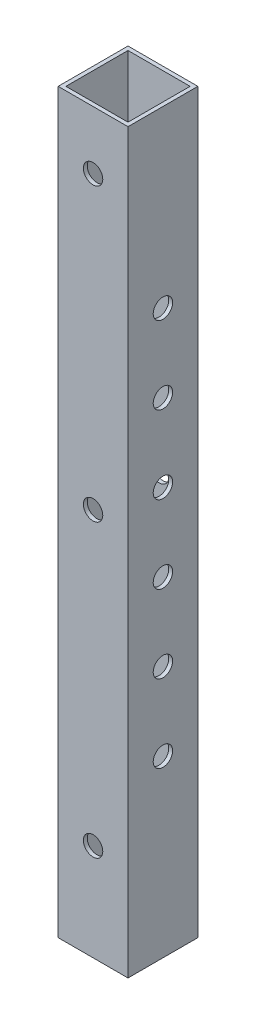
ISO-10303-21;
HEADER;
FILE_DESCRIPTION(('STEP AP214'),'2;1');
FILE_NAME('part.step','',(''),(''),'','','');
FILE_SCHEMA(('AUTOMOTIVE_DESIGN { 1 0 10303 214 1 1 1 1 }'));
ENDSEC;
DATA;
#1=APPLICATION_CONTEXT('core data for automotive mechanical design processes');
#2=APPLICATION_PROTOCOL_DEFINITION('international standard','automotive_design',2000,#1);
#3=PRODUCT_CONTEXT('',#1,'mechanical');
#4=PRODUCT('Part','Part','',(#3));
#5=PRODUCT_RELATED_PRODUCT_CATEGORY('part','',(#4));
#6=PRODUCT_DEFINITION_FORMATION('','',#4);
#7=PRODUCT_DEFINITION_CONTEXT('part definition',#1,'design');
#8=PRODUCT_DEFINITION('design','',#6,#7);
#9=PRODUCT_DEFINITION_SHAPE('','',#8);
#10=(LENGTH_UNIT() NAMED_UNIT(*) SI_UNIT(.MILLI.,.METRE.));
#11=(NAMED_UNIT(*) PLANE_ANGLE_UNIT() SI_UNIT($,.RADIAN.));
#12=(NAMED_UNIT(*) SI_UNIT($,.STERADIAN.) SOLID_ANGLE_UNIT());
#13=UNCERTAINTY_MEASURE_WITH_UNIT(LENGTH_MEASURE(1.E-05),#10,'distance_accuracy_value','');
#14=(GEOMETRIC_REPRESENTATION_CONTEXT(3) GLOBAL_UNCERTAINTY_ASSIGNED_CONTEXT((#13)) GLOBAL_UNIT_ASSIGNED_CONTEXT((#10,
#11,#12)) REPRESENTATION_CONTEXT('',''));
#15=CARTESIAN_POINT('',(0.,0.,0.));
#16=DIRECTION('',(0.,0.,1.));
#17=DIRECTION('',(1.,0.,0.));
#18=AXIS2_PLACEMENT_3D('',#15,#16,#17);
#19=CARTESIAN_POINT('',(0.,0.,45.72));
#20=DIRECTION('',(0.,-1.,0.));
#21=DIRECTION('',(0.,0.,-1.));
#22=AXIS2_PLACEMENT_3D('',#19,#20,#21);
#23=PLANE('',#22);
#24=DIRECTION('',(-1.,0.,0.));
#25=VECTOR('',#24,1.);
#26=CARTESIAN_POINT('',(0.,0.,0.));
#27=LINE('',#26,#25);
#28=CARTESIAN_POINT('',(45.72,0.,0.));
#29=VERTEX_POINT('',#28);
#30=CARTESIAN_POINT('',(0.,0.,0.));
#31=VERTEX_POINT('',#30);
#32=EDGE_CURVE('E142',#29,#31,#27,.T.);
#33=ORIENTED_EDGE('',*,*,#32,.T.);
#34=DIRECTION('',(0.,0.,-1.));
#35=VECTOR('',#34,1.);
#36=CARTESIAN_POINT('',(0.,0.,45.72));
#37=LINE('',#36,#35);
#38=CARTESIAN_POINT('',(0.,0.,45.72));
#39=VERTEX_POINT('',#38);
#40=EDGE_CURVE('E148',#39,#31,#37,.T.);
#41=ORIENTED_EDGE('',*,*,#40,.F.);
#42=DIRECTION('',(-1.,0.,0.));
#43=VECTOR('',#42,1.);
#44=CARTESIAN_POINT('',(0.,0.,45.72));
#45=LINE('',#44,#43);
#46=CARTESIAN_POINT('',(45.72,0.,45.72));
#47=VERTEX_POINT('',#46);
#48=EDGE_CURVE('E146',#47,#39,#45,.T.);
#49=ORIENTED_EDGE('',*,*,#48,.F.);
#50=DIRECTION('',(0.,0.,-1.));
#51=VECTOR('',#50,1.);
#52=CARTESIAN_POINT('',(45.72,0.,45.72));
#53=LINE('',#52,#51);
#54=EDGE_CURVE('E158',#47,#29,#53,.T.);
#55=ORIENTED_EDGE('',*,*,#54,.T.);
#56=EDGE_LOOP('',(#33,#41,#49,#55));
#57=FACE_BOUND('',#56,.T.);
#58=DIRECTION('',(-1.,0.,0.));
#59=VECTOR('',#58,1.);
#60=CARTESIAN_POINT('',(0.,0.,2.54));
#61=LINE('',#60,#59);
#62=CARTESIAN_POINT('',(43.18,0.,2.54));
#63=VERTEX_POINT('',#62);
#64=CARTESIAN_POINT('',(2.54,0.,2.54));
#65=VERTEX_POINT('',#64);
#66=EDGE_CURVE('E109',#63,#65,#61,.T.);
#67=ORIENTED_EDGE('',*,*,#66,.F.);
#68=DIRECTION('',(0.,0.,-1.));
#69=VECTOR('',#68,1.);
#70=CARTESIAN_POINT('',(43.18,0.,45.72));
#71=LINE('',#70,#69);
#72=CARTESIAN_POINT('',(43.18,0.,43.18));
#73=VERTEX_POINT('',#72);
#74=EDGE_CURVE('E132',#73,#63,#71,.T.);
#75=ORIENTED_EDGE('',*,*,#74,.F.);
#76=DIRECTION('',(-1.,0.,0.));
#77=VECTOR('',#76,1.);
#78=CARTESIAN_POINT('',(0.,0.,43.18));
#79=LINE('',#78,#77);
#80=CARTESIAN_POINT('',(2.54,0.,43.18));
#81=VERTEX_POINT('',#80);
#82=EDGE_CURVE('E57',#73,#81,#79,.T.);
#83=ORIENTED_EDGE('',*,*,#82,.T.);
#84=DIRECTION('',(0.,0.,-1.));
#85=VECTOR('',#84,1.);
#86=CARTESIAN_POINT('',(2.54,0.,45.72));
#87=LINE('',#86,#85);
#88=EDGE_CURVE('E108',#81,#65,#87,.T.);
#89=ORIENTED_EDGE('',*,*,#88,.T.);
#90=EDGE_LOOP('',(#67,#75,#83,#89));
#91=FACE_BOUND('',#90,.T.);
#92=ADVANCED_FACE('F35',(#57,#91),#23,.F.);
#93=CARTESIAN_POINT('',(0.,0.,45.72));
#94=DIRECTION('',(1.,0.,0.));
#95=DIRECTION('',(0.,1.,0.));
#96=AXIS2_PLACEMENT_3D('',#93,#94,#95);
#97=PLANE('',#96);
#98=CARTESIAN_POINT('',(0.,-114.3,22.86));
#99=DIRECTION('',(1.,0.,0.));
#100=DIRECTION('',(0.,0.,-1.));
#101=AXIS2_PLACEMENT_3D('',#98,#99,#100);
#102=CIRCLE('',#101,6.34999999999999);
#103=CARTESIAN_POINT('',(0.,-114.3,16.51));
#104=VERTEX_POINT('',#103);
#105=EDGE_CURVE('E547',#104,#104,#102,.T.);
#106=ORIENTED_EDGE('',*,*,#105,.T.);
#107=EDGE_LOOP('',(#106));
#108=FACE_BOUND('',#107,.T.);
#109=CARTESIAN_POINT('',(0.,-165.1,22.86));
#110=DIRECTION('',(1.,0.,0.));
#111=DIRECTION('',(0.,0.,-1.));
#112=AXIS2_PLACEMENT_3D('',#109,#110,#111);
#113=CIRCLE('',#112,6.34999999999999);
#114=CARTESIAN_POINT('',(0.,-165.1,16.51));
#115=VERTEX_POINT('',#114);
#116=EDGE_CURVE('E200',#115,#115,#113,.T.);
#117=ORIENTED_EDGE('',*,*,#116,.T.);
#118=EDGE_LOOP('',(#117));
#119=FACE_BOUND('',#118,.T.);
#120=CARTESIAN_POINT('',(0.,-215.9,22.86));
#121=DIRECTION('',(1.,0.,0.));
#122=DIRECTION('',(0.,0.,-1.));
#123=AXIS2_PLACEMENT_3D('',#120,#121,#122);
#124=CIRCLE('',#123,6.34999999999999);
#125=CARTESIAN_POINT('',(0.,-215.9,16.51));
#126=VERTEX_POINT('',#125);
#127=EDGE_CURVE('E196',#126,#126,#124,.T.);
#128=ORIENTED_EDGE('',*,*,#127,.T.);
#129=EDGE_LOOP('',(#128));
#130=FACE_BOUND('',#129,.T.);
#131=CARTESIAN_POINT('',(0.,-266.7,22.86));
#132=DIRECTION('',(1.,0.,0.));
#133=DIRECTION('',(0.,0.,-1.));
#134=AXIS2_PLACEMENT_3D('',#131,#132,#133);
#135=CIRCLE('',#134,6.34999999999997);
#136=CARTESIAN_POINT('',(0.,-266.7,16.51));
#137=VERTEX_POINT('',#136);
#138=EDGE_CURVE('E192',#137,#137,#135,.T.);
#139=ORIENTED_EDGE('',*,*,#138,.T.);
#140=EDGE_LOOP('',(#139));
#141=FACE_BOUND('',#140,.T.);
#142=CARTESIAN_POINT('',(0.,-317.5,22.86));
#143=DIRECTION('',(1.,0.,0.));
#144=DIRECTION('',(0.,0.,-1.));
#145=AXIS2_PLACEMENT_3D('',#142,#143,#144);
#146=CIRCLE('',#145,6.34999999999997);
#147=CARTESIAN_POINT('',(0.,-317.5,16.51));
#148=VERTEX_POINT('',#147);
#149=EDGE_CURVE('E187',#148,#148,#146,.T.);
#150=ORIENTED_EDGE('',*,*,#149,.T.);
#151=EDGE_LOOP('',(#150));
#152=FACE_BOUND('',#151,.T.);
#153=CARTESIAN_POINT('',(0.,-368.3,22.86));
#154=DIRECTION('',(1.,0.,0.));
#155=DIRECTION('',(0.,0.,-1.));
#156=AXIS2_PLACEMENT_3D('',#153,#154,#155);
#157=CIRCLE('',#156,6.34999999999997);
#158=CARTESIAN_POINT('',(0.,-368.3,16.51));
#159=VERTEX_POINT('',#158);
#160=EDGE_CURVE('E182',#159,#159,#157,.T.);
#161=ORIENTED_EDGE('',*,*,#160,.T.);
#162=EDGE_LOOP('',(#161));
#163=FACE_BOUND('',#162,.T.);
#164=DIRECTION('',(0.,-1.,0.));
#165=VECTOR('',#164,1.);
#166=CARTESIAN_POINT('',(0.,0.,0.));
#167=LINE('',#166,#165);
#168=CARTESIAN_POINT('',(0.,-482.6,0.));
#169=VERTEX_POINT('',#168);
#170=EDGE_CURVE('E136',#31,#169,#167,.T.);
#171=ORIENTED_EDGE('',*,*,#170,.T.);
#172=DIRECTION('',(0.,0.,-1.));
#173=VECTOR('',#172,1.);
#174=CARTESIAN_POINT('',(0.,-482.6,45.72));
#175=LINE('',#174,#173);
#176=CARTESIAN_POINT('',(0.,-482.6,45.72));
#177=VERTEX_POINT('',#176);
#178=EDGE_CURVE('E11',#177,#169,#175,.T.);
#179=ORIENTED_EDGE('',*,*,#178,.F.);
#180=DIRECTION('',(0.,-1.,0.));
#181=VECTOR('',#180,1.);
#182=CARTESIAN_POINT('',(0.,0.,45.72));
#183=LINE('',#182,#181);
#184=EDGE_CURVE('E138',#39,#177,#183,.T.);
#185=ORIENTED_EDGE('',*,*,#184,.F.);
#186=ORIENTED_EDGE('',*,*,#40,.T.);
#187=EDGE_LOOP('',(#171,#179,#185,#186));
#188=FACE_BOUND('',#187,.T.);
#189=ADVANCED_FACE('F37',(#108,#119,#130,#141,#152,#163,#188),#97,.F.);
#190=CARTESIAN_POINT('',(0.,-482.6,45.72));
#191=DIRECTION('',(0.,1.,0.));
#192=DIRECTION('',(0.,0.,1.));
#193=AXIS2_PLACEMENT_3D('',#190,#191,#192);
#194=PLANE('',#193);
#195=DIRECTION('',(-1.,0.,0.));
#196=VECTOR('',#195,1.);
#197=CARTESIAN_POINT('',(43.18,-482.6,43.18));
#198=LINE('',#197,#196);
#199=CARTESIAN_POINT('',(43.18,-482.6,43.18));
#200=VERTEX_POINT('',#199);
#201=CARTESIAN_POINT('',(2.54000000000006,-482.6,43.18));
#202=VERTEX_POINT('',#201);
#203=EDGE_CURVE('E112',#200,#202,#198,.T.);
#204=ORIENTED_EDGE('',*,*,#203,.F.);
#205=DIRECTION('',(0.,0.,1.));
#206=VECTOR('',#205,1.);
#207=CARTESIAN_POINT('',(43.18,-482.6,2.54));
#208=LINE('',#207,#206);
#209=CARTESIAN_POINT('',(43.18,-482.6,2.54));
#210=VERTEX_POINT('',#209);
#211=EDGE_CURVE('E116',#210,#200,#208,.T.);
#212=ORIENTED_EDGE('',*,*,#211,.F.);
#213=DIRECTION('',(1.,0.,0.));
#214=VECTOR('',#213,1.);
#215=CARTESIAN_POINT('',(2.54000000000006,-482.6,2.54));
#216=LINE('',#215,#214);
#217=CARTESIAN_POINT('',(2.54000000000006,-482.6,2.54));
#218=VERTEX_POINT('',#217);
#219=EDGE_CURVE('E121',#218,#210,#216,.T.);
#220=ORIENTED_EDGE('',*,*,#219,.F.);
#221=DIRECTION('',(0.,0.,-1.));
#222=VECTOR('',#221,1.);
#223=CARTESIAN_POINT('',(2.54000000000006,-482.6,43.18));
#224=LINE('',#223,#222);
#225=EDGE_CURVE('E105',#202,#218,#224,.T.);
#226=ORIENTED_EDGE('',*,*,#225,.F.);
#227=EDGE_LOOP('',(#204,#212,#220,#226));
#228=FACE_BOUND('',#227,.T.);
#229=DIRECTION('',(1.,0.,0.));
#230=VECTOR('',#229,1.);
#231=CARTESIAN_POINT('',(0.,-482.6,0.));
#232=LINE('',#231,#230);
#233=CARTESIAN_POINT('',(45.7200000000001,-482.6,0.));
#234=VERTEX_POINT('',#233);
#235=EDGE_CURVE('E151',#169,#234,#232,.T.);
#236=ORIENTED_EDGE('',*,*,#235,.T.);
#237=DIRECTION('',(0.,0.,-1.));
#238=VECTOR('',#237,1.);
#239=CARTESIAN_POINT('',(45.7200000000001,-482.6,45.72));
#240=LINE('',#239,#238);
#241=CARTESIAN_POINT('',(45.7200000000001,-482.6,45.72));
#242=VERTEX_POINT('',#241);
#243=EDGE_CURVE('E44',#242,#234,#240,.T.);
#244=ORIENTED_EDGE('',*,*,#243,.F.);
#245=DIRECTION('',(1.,0.,0.));
#246=VECTOR('',#245,1.);
#247=CARTESIAN_POINT('',(0.,-482.6,45.72));
#248=LINE('',#247,#246);
#249=EDGE_CURVE('E141',#177,#242,#248,.T.);
#250=ORIENTED_EDGE('',*,*,#249,.F.);
#251=ORIENTED_EDGE('',*,*,#178,.T.);
#252=EDGE_LOOP('',(#236,#244,#250,#251));
#253=FACE_BOUND('',#252,.T.);
#254=ADVANCED_FACE('F118',(#228,#253),#194,.F.);
#255=CARTESIAN_POINT('',(45.72,0.,45.72));
#256=DIRECTION('',(-1.,0.,0.));
#257=DIRECTION('',(0.,-1.,0.));
#258=AXIS2_PLACEMENT_3D('',#255,#256,#257);
#259=PLANE('',#258);
#260=CARTESIAN_POINT('',(45.7200000000001,-114.3,22.86));
#261=DIRECTION('',(1.,0.,0.));
#262=DIRECTION('',(0.,0.,-1.));
#263=AXIS2_PLACEMENT_3D('',#260,#261,#262);
#264=CIRCLE('',#263,6.34999999999998);
#265=CARTESIAN_POINT('',(45.7200000000001,-114.3,16.51));
#266=VERTEX_POINT('',#265);
#267=EDGE_CURVE('E548',#266,#266,#264,.T.);
#268=ORIENTED_EDGE('',*,*,#267,.F.);
#269=EDGE_LOOP('',(#268));
#270=FACE_BOUND('',#269,.T.);
#271=CARTESIAN_POINT('',(45.7200000000001,-165.1,22.86));
#272=DIRECTION('',(1.,0.,0.));
#273=DIRECTION('',(0.,0.,-1.));
#274=AXIS2_PLACEMENT_3D('',#271,#272,#273);
#275=CIRCLE('',#274,6.34999999999999);
#276=CARTESIAN_POINT('',(45.7200000000001,-165.1,16.51));
#277=VERTEX_POINT('',#276);
#278=EDGE_CURVE('E207',#277,#277,#275,.T.);
#279=ORIENTED_EDGE('',*,*,#278,.F.);
#280=EDGE_LOOP('',(#279));
#281=FACE_BOUND('',#280,.T.);
#282=CARTESIAN_POINT('',(45.7200000000001,-215.9,22.86));
#283=DIRECTION('',(1.,0.,0.));
#284=DIRECTION('',(0.,0.,-1.));
#285=AXIS2_PLACEMENT_3D('',#282,#283,#284);
#286=CIRCLE('',#285,6.34999999999999);
#287=CARTESIAN_POINT('',(45.7200000000001,-215.9,16.51));
#288=VERTEX_POINT('',#287);
#289=EDGE_CURVE('E204',#288,#288,#286,.T.);
#290=ORIENTED_EDGE('',*,*,#289,.F.);
#291=EDGE_LOOP('',(#290));
#292=FACE_BOUND('',#291,.T.);
#293=CARTESIAN_POINT('',(45.7200000000001,-266.7,22.86));
#294=DIRECTION('',(1.,0.,0.));
#295=DIRECTION('',(0.,0.,-1.));
#296=AXIS2_PLACEMENT_3D('',#293,#294,#295);
#297=CIRCLE('',#296,6.34999999999997);
#298=CARTESIAN_POINT('',(45.7200000000001,-266.7,16.51));
#299=VERTEX_POINT('',#298);
#300=EDGE_CURVE('E222',#299,#299,#297,.T.);
#301=ORIENTED_EDGE('',*,*,#300,.F.);
#302=EDGE_LOOP('',(#301));
#303=FACE_BOUND('',#302,.T.);
#304=CARTESIAN_POINT('',(45.7200000000001,-317.5,22.86));
#305=DIRECTION('',(1.,0.,0.));
#306=DIRECTION('',(0.,0.,-1.));
#307=AXIS2_PLACEMENT_3D('',#304,#305,#306);
#308=CIRCLE('',#307,6.34999999999997);
#309=CARTESIAN_POINT('',(45.7200000000001,-317.5,16.51));
#310=VERTEX_POINT('',#309);
#311=EDGE_CURVE('E229',#310,#310,#308,.T.);
#312=ORIENTED_EDGE('',*,*,#311,.F.);
#313=EDGE_LOOP('',(#312));
#314=FACE_BOUND('',#313,.T.);
#315=CARTESIAN_POINT('',(45.7200000000001,-368.3,22.86));
#316=DIRECTION('',(1.,0.,0.));
#317=DIRECTION('',(0.,0.,-1.));
#318=AXIS2_PLACEMENT_3D('',#315,#316,#317);
#319=CIRCLE('',#318,6.34999999999997);
#320=CARTESIAN_POINT('',(45.7200000000001,-368.3,16.51));
#321=VERTEX_POINT('',#320);
#322=EDGE_CURVE('E236',#321,#321,#319,.T.);
#323=ORIENTED_EDGE('',*,*,#322,.F.);
#324=EDGE_LOOP('',(#323));
#325=FACE_BOUND('',#324,.T.);
#326=DIRECTION('',(0.,1.,0.));
#327=VECTOR('',#326,1.);
#328=CARTESIAN_POINT('',(45.72,0.,0.));
#329=LINE('',#328,#327);
#330=EDGE_CURVE('E153',#234,#29,#329,.T.);
#331=ORIENTED_EDGE('',*,*,#330,.T.);
#332=ORIENTED_EDGE('',*,*,#54,.F.);
#333=DIRECTION('',(0.,1.,0.));
#334=VECTOR('',#333,1.);
#335=CARTESIAN_POINT('',(45.72,0.,45.72));
#336=LINE('',#335,#334);
#337=EDGE_CURVE('E144',#242,#47,#336,.T.);
#338=ORIENTED_EDGE('',*,*,#337,.F.);
#339=ORIENTED_EDGE('',*,*,#243,.T.);
#340=EDGE_LOOP('',(#331,#332,#338,#339));
#341=FACE_BOUND('',#340,.T.);
#342=ADVANCED_FACE('F281',(#270,#281,#292,#303,#314,#325,#341),#259,.F.);
#343=CARTESIAN_POINT('',(0.,0.,45.72));
#344=DIRECTION('',(0.,0.,1.));
#345=DIRECTION('',(1.,0.,0.));
#346=AXIS2_PLACEMENT_3D('',#343,#344,#345);
#347=PLANE('',#346);
#348=CARTESIAN_POINT('',(22.86,-38.1,45.72));
#349=DIRECTION('',(0.,0.,1.));
#350=DIRECTION('',(1.,0.,0.));
#351=AXIS2_PLACEMENT_3D('',#348,#349,#350);
#352=CIRCLE('',#351,6.34999999999999);
#353=CARTESIAN_POINT('',(29.21,-38.1,45.72));
#354=VERTEX_POINT('',#353);
#355=EDGE_CURVE('E243',#354,#354,#352,.T.);
#356=ORIENTED_EDGE('',*,*,#355,.F.);
#357=EDGE_LOOP('',(#356));
#358=FACE_BOUND('',#357,.T.);
#359=CARTESIAN_POINT('',(22.86,-228.6,45.72));
#360=DIRECTION('',(0.,0.,1.));
#361=DIRECTION('',(1.,0.,0.));
#362=AXIS2_PLACEMENT_3D('',#359,#360,#361);
#363=CIRCLE('',#362,6.34999999999999);
#364=CARTESIAN_POINT('',(29.21,-228.6,45.72));
#365=VERTEX_POINT('',#364);
#366=EDGE_CURVE('E250',#365,#365,#363,.T.);
#367=ORIENTED_EDGE('',*,*,#366,.F.);
#368=EDGE_LOOP('',(#367));
#369=FACE_BOUND('',#368,.T.);
#370=CARTESIAN_POINT('',(22.86,-419.1,45.72));
#371=DIRECTION('',(0.,0.,1.));
#372=DIRECTION('',(1.,0.,0.));
#373=AXIS2_PLACEMENT_3D('',#370,#371,#372);
#374=CIRCLE('',#373,6.34999999999999);
#375=CARTESIAN_POINT('',(29.21,-419.1,45.72));
#376=VERTEX_POINT('',#375);
#377=EDGE_CURVE('E257',#376,#376,#374,.T.);
#378=ORIENTED_EDGE('',*,*,#377,.F.);
#379=EDGE_LOOP('',(#378));
#380=FACE_BOUND('',#379,.T.);
#381=ORIENTED_EDGE('',*,*,#184,.T.);
#382=ORIENTED_EDGE('',*,*,#249,.T.);
#383=ORIENTED_EDGE('',*,*,#337,.T.);
#384=ORIENTED_EDGE('',*,*,#48,.T.);
#385=EDGE_LOOP('',(#381,#382,#383,#384));
#386=FACE_BOUND('',#385,.T.);
#387=ADVANCED_FACE('F283',(#358,#369,#380,#386),#347,.T.);
#388=CARTESIAN_POINT('',(0.,0.,0.));
#389=DIRECTION('',(0.,0.,1.));
#390=DIRECTION('',(1.,0.,0.));
#391=AXIS2_PLACEMENT_3D('',#388,#389,#390);
#392=PLANE('',#391);
#393=CARTESIAN_POINT('',(22.86,-38.1,0.));
#394=DIRECTION('',(0.,0.,1.));
#395=DIRECTION('',(1.,0.,0.));
#396=AXIS2_PLACEMENT_3D('',#393,#394,#395);
#397=CIRCLE('',#396,6.34999999999999);
#398=CARTESIAN_POINT('',(29.21,-38.1,0.));
#399=VERTEX_POINT('',#398);
#400=EDGE_CURVE('E177',#399,#399,#397,.T.);
#401=ORIENTED_EDGE('',*,*,#400,.T.);
#402=EDGE_LOOP('',(#401));
#403=FACE_BOUND('',#402,.T.);
#404=CARTESIAN_POINT('',(22.86,-228.6,0.));
#405=DIRECTION('',(0.,0.,1.));
#406=DIRECTION('',(1.,0.,0.));
#407=AXIS2_PLACEMENT_3D('',#404,#405,#406);
#408=CIRCLE('',#407,6.34999999999999);
#409=CARTESIAN_POINT('',(29.21,-228.6,0.));
#410=VERTEX_POINT('',#409);
#411=EDGE_CURVE('E172',#410,#410,#408,.T.);
#412=ORIENTED_EDGE('',*,*,#411,.T.);
#413=EDGE_LOOP('',(#412));
#414=FACE_BOUND('',#413,.T.);
#415=CARTESIAN_POINT('',(22.86,-419.1,0.));
#416=DIRECTION('',(0.,0.,1.));
#417=DIRECTION('',(1.,0.,0.));
#418=AXIS2_PLACEMENT_3D('',#415,#416,#417);
#419=CIRCLE('',#418,6.34999999999999);
#420=CARTESIAN_POINT('',(29.21,-419.1,0.));
#421=VERTEX_POINT('',#420);
#422=EDGE_CURVE('E167',#421,#421,#419,.T.);
#423=ORIENTED_EDGE('',*,*,#422,.T.);
#424=EDGE_LOOP('',(#423));
#425=FACE_BOUND('',#424,.T.);
#426=ORIENTED_EDGE('',*,*,#170,.F.);
#427=ORIENTED_EDGE('',*,*,#32,.F.);
#428=ORIENTED_EDGE('',*,*,#330,.F.);
#429=ORIENTED_EDGE('',*,*,#235,.F.);
#430=EDGE_LOOP('',(#426,#427,#428,#429));
#431=FACE_BOUND('',#430,.T.);
#432=ADVANCED_FACE('F279',(#403,#414,#425,#431),#392,.F.);
#433=CARTESIAN_POINT('',(2.54,0.,45.72));
#434=DIRECTION('',(1.,0.,0.));
#435=DIRECTION('',(0.,1.,0.));
#436=AXIS2_PLACEMENT_3D('',#433,#434,#435);
#437=PLANE('',#436);
#438=CARTESIAN_POINT('',(2.54000000000001,-114.3,22.86));
#439=DIRECTION('',(1.,0.,0.));
#440=DIRECTION('',(0.,1.,0.));
#441=AXIS2_PLACEMENT_3D('',#438,#439,#440);
#442=CIRCLE('',#441,6.34999999999999);
#443=CARTESIAN_POINT('',(2.54000000000001,-107.95,22.86));
#444=VERTEX_POINT('',#443);
#445=EDGE_CURVE('E212',#444,#444,#442,.T.);
#446=ORIENTED_EDGE('',*,*,#445,.F.);
#447=EDGE_LOOP('',(#446));
#448=FACE_BOUND('',#447,.T.);
#449=CARTESIAN_POINT('',(2.54000000000002,-165.1,22.86));
#450=DIRECTION('',(1.,0.,0.));
#451=DIRECTION('',(0.,1.,0.));
#452=AXIS2_PLACEMENT_3D('',#449,#450,#451);
#453=CIRCLE('',#452,6.34999999999999);
#454=CARTESIAN_POINT('',(2.54000000000002,-158.75,22.86));
#455=VERTEX_POINT('',#454);
#456=EDGE_CURVE('E197',#455,#455,#453,.T.);
#457=ORIENTED_EDGE('',*,*,#456,.F.);
#458=EDGE_LOOP('',(#457));
#459=FACE_BOUND('',#458,.T.);
#460=CARTESIAN_POINT('',(2.54000000000003,-215.9,22.86));
#461=DIRECTION('',(1.,0.,0.));
#462=DIRECTION('',(0.,1.,0.));
#463=AXIS2_PLACEMENT_3D('',#460,#461,#462);
#464=CIRCLE('',#463,6.34999999999999);
#465=CARTESIAN_POINT('',(2.54000000000003,-209.55,22.86));
#466=VERTEX_POINT('',#465);
#467=EDGE_CURVE('E193',#466,#466,#464,.T.);
#468=ORIENTED_EDGE('',*,*,#467,.F.);
#469=EDGE_LOOP('',(#468));
#470=FACE_BOUND('',#469,.T.);
#471=CARTESIAN_POINT('',(2.54000000000004,-266.7,22.86));
#472=DIRECTION('',(1.,0.,0.));
#473=DIRECTION('',(0.,1.,0.));
#474=AXIS2_PLACEMENT_3D('',#471,#472,#473);
#475=CIRCLE('',#474,6.34999999999997);
#476=CARTESIAN_POINT('',(2.54000000000003,-260.35,22.86));
#477=VERTEX_POINT('',#476);
#478=EDGE_CURVE('E191',#477,#477,#475,.T.);
#479=ORIENTED_EDGE('',*,*,#478,.F.);
#480=EDGE_LOOP('',(#479));
#481=FACE_BOUND('',#480,.T.);
#482=CARTESIAN_POINT('',(2.54000000000004,-317.5,22.86));
#483=DIRECTION('',(1.,0.,0.));
#484=DIRECTION('',(0.,1.,0.));
#485=AXIS2_PLACEMENT_3D('',#482,#483,#484);
#486=CIRCLE('',#485,6.34999999999997);
#487=CARTESIAN_POINT('',(2.54000000000004,-311.15,22.86));
#488=VERTEX_POINT('',#487);
#489=EDGE_CURVE('E186',#488,#488,#486,.T.);
#490=ORIENTED_EDGE('',*,*,#489,.F.);
#491=EDGE_LOOP('',(#490));
#492=FACE_BOUND('',#491,.T.);
#493=CARTESIAN_POINT('',(2.54000000000005,-368.3,22.86));
#494=DIRECTION('',(1.,0.,0.));
#495=DIRECTION('',(0.,1.,0.));
#496=AXIS2_PLACEMENT_3D('',#493,#494,#495);
#497=CIRCLE('',#496,6.34999999999997);
#498=CARTESIAN_POINT('',(2.54000000000005,-361.95,22.86));
#499=VERTEX_POINT('',#498);
#500=EDGE_CURVE('E178',#499,#499,#497,.T.);
#501=ORIENTED_EDGE('',*,*,#500,.F.);
#502=EDGE_LOOP('',(#501));
#503=FACE_BOUND('',#502,.T.);
#504=DIRECTION('',(0.,-1.,0.));
#505=VECTOR('',#504,1.);
#506=CARTESIAN_POINT('',(2.54,0.,2.54));
#507=LINE('',#506,#505);
#508=EDGE_CURVE('E123',#65,#218,#507,.T.);
#509=ORIENTED_EDGE('',*,*,#508,.F.);
#510=ORIENTED_EDGE('',*,*,#88,.F.);
#511=DIRECTION('',(0.,-1.,0.));
#512=VECTOR('',#511,1.);
#513=CARTESIAN_POINT('',(2.54,0.,43.18));
#514=LINE('',#513,#512);
#515=EDGE_CURVE('E101',#81,#202,#514,.T.);
#516=ORIENTED_EDGE('',*,*,#515,.T.);
#517=ORIENTED_EDGE('',*,*,#225,.T.);
#518=EDGE_LOOP('',(#509,#510,#516,#517));
#519=FACE_BOUND('',#518,.T.);
#520=ADVANCED_FACE('F103',(#448,#459,#470,#481,#492,#503,#519),#437,.T.);
#521=CARTESIAN_POINT('',(43.18,0.,45.72));
#522=DIRECTION('',(-1.,0.,0.));
#523=DIRECTION('',(0.,-1.,0.));
#524=AXIS2_PLACEMENT_3D('',#521,#522,#523);
#525=PLANE('',#524);
#526=CARTESIAN_POINT('',(43.18,-114.3,22.86));
#527=DIRECTION('',(-1.,0.,0.));
#528=DIRECTION('',(0.,-1.,0.));
#529=AXIS2_PLACEMENT_3D('',#526,#527,#528);
#530=CIRCLE('',#529,6.34999999999999);
#531=CARTESIAN_POINT('',(43.18,-120.65,22.86));
#532=VERTEX_POINT('',#531);
#533=EDGE_CURVE('E39',#532,#532,#530,.T.);
#534=ORIENTED_EDGE('',*,*,#533,.F.);
#535=EDGE_LOOP('',(#534));
#536=FACE_BOUND('',#535,.T.);
#537=CARTESIAN_POINT('',(43.18,-165.1,22.86));
#538=DIRECTION('',(-1.,0.,0.));
#539=DIRECTION('',(0.,-1.,0.));
#540=AXIS2_PLACEMENT_3D('',#537,#538,#539);
#541=CIRCLE('',#540,6.34999999999999);
#542=CARTESIAN_POINT('',(43.18,-171.45,22.86));
#543=VERTEX_POINT('',#542);
#544=EDGE_CURVE('E199',#543,#543,#541,.T.);
#545=ORIENTED_EDGE('',*,*,#544,.F.);
#546=EDGE_LOOP('',(#545));
#547=FACE_BOUND('',#546,.T.);
#548=CARTESIAN_POINT('',(43.18,-215.9,22.86));
#549=DIRECTION('',(-1.,0.,0.));
#550=DIRECTION('',(0.,-1.,0.));
#551=AXIS2_PLACEMENT_3D('',#548,#549,#550);
#552=CIRCLE('',#551,6.34999999999999);
#553=CARTESIAN_POINT('',(43.18,-222.25,22.86));
#554=VERTEX_POINT('',#553);
#555=EDGE_CURVE('E195',#554,#554,#552,.T.);
#556=ORIENTED_EDGE('',*,*,#555,.F.);
#557=EDGE_LOOP('',(#556));
#558=FACE_BOUND('',#557,.T.);
#559=CARTESIAN_POINT('',(43.18,-266.7,22.86));
#560=DIRECTION('',(-1.,0.,0.));
#561=DIRECTION('',(0.,-1.,0.));
#562=AXIS2_PLACEMENT_3D('',#559,#560,#561);
#563=CIRCLE('',#562,6.34999999999997);
#564=CARTESIAN_POINT('',(43.18,-273.05,22.86));
#565=VERTEX_POINT('',#564);
#566=EDGE_CURVE('E188',#565,#565,#563,.T.);
#567=ORIENTED_EDGE('',*,*,#566,.F.);
#568=EDGE_LOOP('',(#567));
#569=FACE_BOUND('',#568,.T.);
#570=CARTESIAN_POINT('',(43.18,-317.5,22.86));
#571=DIRECTION('',(-1.,0.,0.));
#572=DIRECTION('',(0.,-1.,0.));
#573=AXIS2_PLACEMENT_3D('',#570,#571,#572);
#574=CIRCLE('',#573,6.34999999999997);
#575=CARTESIAN_POINT('',(43.18,-323.85,22.86));
#576=VERTEX_POINT('',#575);
#577=EDGE_CURVE('E183',#576,#576,#574,.T.);
#578=ORIENTED_EDGE('',*,*,#577,.F.);
#579=EDGE_LOOP('',(#578));
#580=FACE_BOUND('',#579,.T.);
#581=CARTESIAN_POINT('',(43.18,-368.3,22.86));
#582=DIRECTION('',(-1.,0.,0.));
#583=DIRECTION('',(0.,-1.,0.));
#584=AXIS2_PLACEMENT_3D('',#581,#582,#583);
#585=CIRCLE('',#584,6.34999999999997);
#586=CARTESIAN_POINT('',(43.18,-374.65,22.86));
#587=VERTEX_POINT('',#586);
#588=EDGE_CURVE('E181',#587,#587,#585,.T.);
#589=ORIENTED_EDGE('',*,*,#588,.F.);
#590=EDGE_LOOP('',(#589));
#591=FACE_BOUND('',#590,.T.);
#592=DIRECTION('',(0.,1.,0.));
#593=VECTOR('',#592,1.);
#594=CARTESIAN_POINT('',(43.18,0.,2.54));
#595=LINE('',#594,#593);
#596=EDGE_CURVE('E127',#210,#63,#595,.T.);
#597=ORIENTED_EDGE('',*,*,#596,.F.);
#598=ORIENTED_EDGE('',*,*,#211,.T.);
#599=DIRECTION('',(0.,1.,0.));
#600=VECTOR('',#599,1.);
#601=CARTESIAN_POINT('',(43.18,0.,43.18));
#602=LINE('',#601,#600);
#603=EDGE_CURVE('E52',#200,#73,#602,.T.);
#604=ORIENTED_EDGE('',*,*,#603,.T.);
#605=ORIENTED_EDGE('',*,*,#74,.T.);
#606=EDGE_LOOP('',(#597,#598,#604,#605));
#607=FACE_BOUND('',#606,.T.);
#608=ADVANCED_FACE('F264',(#536,#547,#558,#569,#580,#591,#607),#525,.T.);
#609=CARTESIAN_POINT('',(0.,0.,43.18));
#610=DIRECTION('',(0.,0.,1.));
#611=DIRECTION('',(1.,0.,0.));
#612=AXIS2_PLACEMENT_3D('',#609,#610,#611);
#613=PLANE('',#612);
#614=CARTESIAN_POINT('',(22.86,-38.1,43.18));
#615=DIRECTION('',(0.,0.,1.));
#616=DIRECTION('',(1.,0.,0.));
#617=AXIS2_PLACEMENT_3D('',#614,#615,#616);
#618=CIRCLE('',#617,6.34999999999999);
#619=CARTESIAN_POINT('',(29.21,-38.1,43.18));
#620=VERTEX_POINT('',#619);
#621=EDGE_CURVE('E176',#620,#620,#618,.T.);
#622=ORIENTED_EDGE('',*,*,#621,.T.);
#623=EDGE_LOOP('',(#622));
#624=FACE_BOUND('',#623,.T.);
#625=CARTESIAN_POINT('',(22.86,-228.6,43.18));
#626=DIRECTION('',(0.,0.,1.));
#627=DIRECTION('',(1.,0.,0.));
#628=AXIS2_PLACEMENT_3D('',#625,#626,#627);
#629=CIRCLE('',#628,6.34999999999999);
#630=CARTESIAN_POINT('',(29.21,-228.6,43.18));
#631=VERTEX_POINT('',#630);
#632=EDGE_CURVE('E171',#631,#631,#629,.T.);
#633=ORIENTED_EDGE('',*,*,#632,.T.);
#634=EDGE_LOOP('',(#633));
#635=FACE_BOUND('',#634,.T.);
#636=CARTESIAN_POINT('',(22.86,-419.1,43.18));
#637=DIRECTION('',(0.,0.,1.));
#638=DIRECTION('',(1.,0.,0.));
#639=AXIS2_PLACEMENT_3D('',#636,#637,#638);
#640=CIRCLE('',#639,6.34999999999999);
#641=CARTESIAN_POINT('',(29.21,-419.1,43.18));
#642=VERTEX_POINT('',#641);
#643=EDGE_CURVE('E163',#642,#642,#640,.T.);
#644=ORIENTED_EDGE('',*,*,#643,.T.);
#645=EDGE_LOOP('',(#644));
#646=FACE_BOUND('',#645,.T.);
#647=ORIENTED_EDGE('',*,*,#515,.F.);
#648=ORIENTED_EDGE('',*,*,#82,.F.);
#649=ORIENTED_EDGE('',*,*,#603,.F.);
#650=ORIENTED_EDGE('',*,*,#203,.T.);
#651=EDGE_LOOP('',(#647,#648,#649,#650));
#652=FACE_BOUND('',#651,.T.);
#653=ADVANCED_FACE('F113',(#624,#635,#646,#652),#613,.F.);
#654=CARTESIAN_POINT('',(0.,0.,2.54));
#655=DIRECTION('',(0.,0.,1.));
#656=DIRECTION('',(1.,0.,0.));
#657=AXIS2_PLACEMENT_3D('',#654,#655,#656);
#658=PLANE('',#657);
#659=CARTESIAN_POINT('',(22.86,-38.1,2.54));
#660=DIRECTION('',(0.,0.,1.));
#661=DIRECTION('',(1.,0.,0.));
#662=AXIS2_PLACEMENT_3D('',#659,#660,#661);
#663=CIRCLE('',#662,6.34999999999999);
#664=CARTESIAN_POINT('',(29.21,-38.1,2.54));
#665=VERTEX_POINT('',#664);
#666=EDGE_CURVE('E173',#665,#665,#663,.T.);
#667=ORIENTED_EDGE('',*,*,#666,.F.);
#668=EDGE_LOOP('',(#667));
#669=FACE_BOUND('',#668,.T.);
#670=CARTESIAN_POINT('',(22.86,-228.6,2.54));
#671=DIRECTION('',(0.,0.,1.));
#672=DIRECTION('',(1.,0.,0.));
#673=AXIS2_PLACEMENT_3D('',#670,#671,#672);
#674=CIRCLE('',#673,6.34999999999999);
#675=CARTESIAN_POINT('',(29.21,-228.6,2.54));
#676=VERTEX_POINT('',#675);
#677=EDGE_CURVE('E168',#676,#676,#674,.T.);
#678=ORIENTED_EDGE('',*,*,#677,.F.);
#679=EDGE_LOOP('',(#678));
#680=FACE_BOUND('',#679,.T.);
#681=CARTESIAN_POINT('',(22.86,-419.1,2.54));
#682=DIRECTION('',(0.,0.,1.));
#683=DIRECTION('',(1.,0.,0.));
#684=AXIS2_PLACEMENT_3D('',#681,#682,#683);
#685=CIRCLE('',#684,6.34999999999999);
#686=CARTESIAN_POINT('',(29.21,-419.1,2.54));
#687=VERTEX_POINT('',#686);
#688=EDGE_CURVE('E166',#687,#687,#685,.T.);
#689=ORIENTED_EDGE('',*,*,#688,.F.);
#690=EDGE_LOOP('',(#689));
#691=FACE_BOUND('',#690,.T.);
#692=ORIENTED_EDGE('',*,*,#508,.T.);
#693=ORIENTED_EDGE('',*,*,#219,.T.);
#694=ORIENTED_EDGE('',*,*,#596,.T.);
#695=ORIENTED_EDGE('',*,*,#66,.T.);
#696=EDGE_LOOP('',(#692,#693,#694,#695));
#697=FACE_BOUND('',#696,.T.);
#698=ADVANCED_FACE('F268',(#669,#680,#691,#697),#658,.T.);
#699=CARTESIAN_POINT('',(22.86,-419.1,45.72));
#700=DIRECTION('',(0.,0.,1.));
#701=DIRECTION('',(1.,0.,0.));
#702=AXIS2_PLACEMENT_3D('',#699,#700,#701);
#703=CYLINDRICAL_SURFACE('',#702,6.34999999999999);
#704=ORIENTED_EDGE('',*,*,#377,.T.);
#705=EDGE_LOOP('',(#704));
#706=FACE_BOUND('',#705,.T.);
#707=ORIENTED_EDGE('',*,*,#643,.F.);
#708=EDGE_LOOP('',(#707));
#709=FACE_BOUND('',#708,.T.);
#710=ADVANCED_FACE('F334',(#706,#709),#703,.F.);
#711=ORIENTED_EDGE('',*,*,#688,.T.);
#712=EDGE_LOOP('',(#711));
#713=FACE_BOUND('',#712,.T.);
#714=ORIENTED_EDGE('',*,*,#422,.F.);
#715=EDGE_LOOP('',(#714));
#716=FACE_BOUND('',#715,.T.);
#717=ADVANCED_FACE('F342',(#713,#716),#703,.F.);
#718=CARTESIAN_POINT('',(22.86,-228.6,45.72));
#719=DIRECTION('',(0.,0.,1.));
#720=DIRECTION('',(1.,0.,0.));
#721=AXIS2_PLACEMENT_3D('',#718,#719,#720);
#722=CYLINDRICAL_SURFACE('',#721,6.34999999999999);
#723=ORIENTED_EDGE('',*,*,#677,.T.);
#724=EDGE_LOOP('',(#723));
#725=FACE_BOUND('',#724,.T.);
#726=ORIENTED_EDGE('',*,*,#411,.F.);
#727=EDGE_LOOP('',(#726));
#728=FACE_BOUND('',#727,.T.);
#729=ADVANCED_FACE('F350',(#725,#728),#722,.F.);
#730=ORIENTED_EDGE('',*,*,#366,.T.);
#731=EDGE_LOOP('',(#730));
#732=FACE_BOUND('',#731,.T.);
#733=ORIENTED_EDGE('',*,*,#632,.F.);
#734=EDGE_LOOP('',(#733));
#735=FACE_BOUND('',#734,.T.);
#736=ADVANCED_FACE('F357',(#732,#735),#722,.F.);
#737=CARTESIAN_POINT('',(22.86,-38.1,45.72));
#738=DIRECTION('',(0.,0.,1.));
#739=DIRECTION('',(1.,0.,0.));
#740=AXIS2_PLACEMENT_3D('',#737,#738,#739);
#741=CYLINDRICAL_SURFACE('',#740,6.34999999999999);
#742=ORIENTED_EDGE('',*,*,#666,.T.);
#743=EDGE_LOOP('',(#742));
#744=FACE_BOUND('',#743,.T.);
#745=ORIENTED_EDGE('',*,*,#400,.F.);
#746=EDGE_LOOP('',(#745));
#747=FACE_BOUND('',#746,.T.);
#748=ADVANCED_FACE('F365',(#744,#747),#741,.F.);
#749=ORIENTED_EDGE('',*,*,#355,.T.);
#750=EDGE_LOOP('',(#749));
#751=FACE_BOUND('',#750,.T.);
#752=ORIENTED_EDGE('',*,*,#621,.F.);
#753=EDGE_LOOP('',(#752));
#754=FACE_BOUND('',#753,.T.);
#755=ADVANCED_FACE('F372',(#751,#754),#741,.F.);
#756=CARTESIAN_POINT('',(45.7200000000001,-368.3,22.86));
#757=DIRECTION('',(1.,0.,0.));
#758=DIRECTION('',(0.,0.,-1.));
#759=AXIS2_PLACEMENT_3D('',#756,#757,#758);
#760=CYLINDRICAL_SURFACE('',#759,6.34999999999997);
#761=ORIENTED_EDGE('',*,*,#500,.T.);
#762=EDGE_LOOP('',(#761));
#763=FACE_BOUND('',#762,.T.);
#764=ORIENTED_EDGE('',*,*,#160,.F.);
#765=EDGE_LOOP('',(#764));
#766=FACE_BOUND('',#765,.T.);
#767=ADVANCED_FACE('F380',(#763,#766),#760,.F.);
#768=ORIENTED_EDGE('',*,*,#588,.T.);
#769=EDGE_LOOP('',(#768));
#770=FACE_BOUND('',#769,.T.);
#771=ORIENTED_EDGE('',*,*,#322,.T.);
#772=EDGE_LOOP('',(#771));
#773=FACE_BOUND('',#772,.T.);
#774=ADVANCED_FACE('F386',(#770,#773),#760,.F.);
#775=CARTESIAN_POINT('',(45.7200000000001,-317.5,22.86));
#776=DIRECTION('',(1.,0.,0.));
#777=DIRECTION('',(0.,0.,-1.));
#778=AXIS2_PLACEMENT_3D('',#775,#776,#777);
#779=CYLINDRICAL_SURFACE('',#778,6.34999999999997);
#780=ORIENTED_EDGE('',*,*,#577,.T.);
#781=EDGE_LOOP('',(#780));
#782=FACE_BOUND('',#781,.T.);
#783=ORIENTED_EDGE('',*,*,#311,.T.);
#784=EDGE_LOOP('',(#783));
#785=FACE_BOUND('',#784,.T.);
#786=ADVANCED_FACE('F394',(#782,#785),#779,.F.);
#787=ORIENTED_EDGE('',*,*,#489,.T.);
#788=EDGE_LOOP('',(#787));
#789=FACE_BOUND('',#788,.T.);
#790=ORIENTED_EDGE('',*,*,#149,.F.);
#791=EDGE_LOOP('',(#790));
#792=FACE_BOUND('',#791,.T.);
#793=ADVANCED_FACE('F401',(#789,#792),#779,.F.);
#794=CARTESIAN_POINT('',(45.7200000000001,-266.7,22.86));
#795=DIRECTION('',(1.,0.,0.));
#796=DIRECTION('',(0.,0.,-1.));
#797=AXIS2_PLACEMENT_3D('',#794,#795,#796);
#798=CYLINDRICAL_SURFACE('',#797,6.34999999999997);
#799=ORIENTED_EDGE('',*,*,#566,.T.);
#800=EDGE_LOOP('',(#799));
#801=FACE_BOUND('',#800,.T.);
#802=ORIENTED_EDGE('',*,*,#300,.T.);
#803=EDGE_LOOP('',(#802));
#804=FACE_BOUND('',#803,.T.);
#805=ADVANCED_FACE('F409',(#801,#804),#798,.F.);
#806=ORIENTED_EDGE('',*,*,#478,.T.);
#807=EDGE_LOOP('',(#806));
#808=FACE_BOUND('',#807,.T.);
#809=ORIENTED_EDGE('',*,*,#138,.F.);
#810=EDGE_LOOP('',(#809));
#811=FACE_BOUND('',#810,.T.);
#812=ADVANCED_FACE('F416',(#808,#811),#798,.F.);
#813=CARTESIAN_POINT('',(45.7200000000001,-215.9,22.86));
#814=DIRECTION('',(1.,0.,0.));
#815=DIRECTION('',(0.,0.,-1.));
#816=AXIS2_PLACEMENT_3D('',#813,#814,#815);
#817=CYLINDRICAL_SURFACE('',#816,6.34999999999999);
#818=ORIENTED_EDGE('',*,*,#467,.T.);
#819=EDGE_LOOP('',(#818));
#820=FACE_BOUND('',#819,.T.);
#821=ORIENTED_EDGE('',*,*,#127,.F.);
#822=EDGE_LOOP('',(#821));
#823=FACE_BOUND('',#822,.T.);
#824=ADVANCED_FACE('F424',(#820,#823),#817,.F.);
#825=ORIENTED_EDGE('',*,*,#555,.T.);
#826=EDGE_LOOP('',(#825));
#827=FACE_BOUND('',#826,.T.);
#828=ORIENTED_EDGE('',*,*,#289,.T.);
#829=EDGE_LOOP('',(#828));
#830=FACE_BOUND('',#829,.T.);
#831=ADVANCED_FACE('F431',(#827,#830),#817,.F.);
#832=CARTESIAN_POINT('',(45.7200000000001,-165.1,22.86));
#833=DIRECTION('',(1.,0.,0.));
#834=DIRECTION('',(0.,0.,-1.));
#835=AXIS2_PLACEMENT_3D('',#832,#833,#834);
#836=CYLINDRICAL_SURFACE('',#835,6.34999999999999);
#837=ORIENTED_EDGE('',*,*,#456,.T.);
#838=EDGE_LOOP('',(#837));
#839=FACE_BOUND('',#838,.T.);
#840=ORIENTED_EDGE('',*,*,#116,.F.);
#841=EDGE_LOOP('',(#840));
#842=FACE_BOUND('',#841,.T.);
#843=ADVANCED_FACE('F439',(#839,#842),#836,.F.);
#844=ORIENTED_EDGE('',*,*,#544,.T.);
#845=EDGE_LOOP('',(#844));
#846=FACE_BOUND('',#845,.T.);
#847=ORIENTED_EDGE('',*,*,#278,.T.);
#848=EDGE_LOOP('',(#847));
#849=FACE_BOUND('',#848,.T.);
#850=ADVANCED_FACE('F446',(#846,#849),#836,.F.);
#851=CARTESIAN_POINT('',(45.7200000000001,-114.3,22.86));
#852=DIRECTION('',(1.,0.,0.));
#853=DIRECTION('',(0.,0.,-1.));
#854=AXIS2_PLACEMENT_3D('',#851,#852,#853);
#855=CYLINDRICAL_SURFACE('',#854,6.34999999999999);
#856=ORIENTED_EDGE('',*,*,#533,.T.);
#857=EDGE_LOOP('',(#856));
#858=FACE_BOUND('',#857,.T.);
#859=ORIENTED_EDGE('',*,*,#267,.T.);
#860=EDGE_LOOP('',(#859));
#861=FACE_BOUND('',#860,.T.);
#862=ADVANCED_FACE('F453',(#858,#861),#855,.F.);
#863=ORIENTED_EDGE('',*,*,#445,.T.);
#864=EDGE_LOOP('',(#863));
#865=FACE_BOUND('',#864,.T.);
#866=ORIENTED_EDGE('',*,*,#105,.F.);
#867=EDGE_LOOP('',(#866));
#868=FACE_BOUND('',#867,.T.);
#869=ADVANCED_FACE('F460',(#865,#868),#855,.F.);
#870=CLOSED_SHELL('',(#92,#189,#254,#342,#387,#432,#520,#608,#653,#698,#710,#717,#729,#736,#748,
#755,#767,#774,#786,#793,#805,#812,#824,#831,#843,#850,#862,#869));
#871=MANIFOLD_SOLID_BREP('B2',#870);
#872=ADVANCED_BREP_SHAPE_REPRESENTATION('',(#18,#871),#14);
#873=SHAPE_DEFINITION_REPRESENTATION(#9,#872);
ENDSEC;
END-ISO-10303-21;
